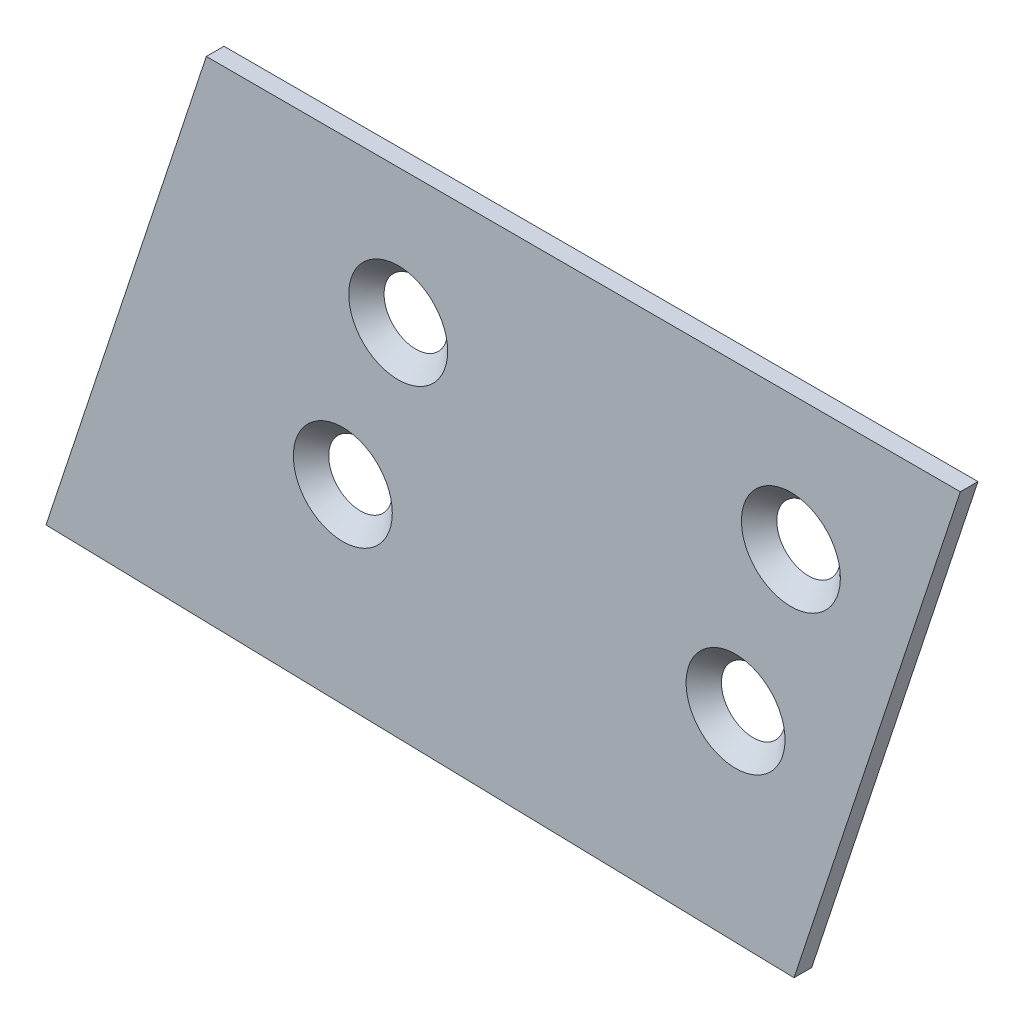
ISO-10303-21;
HEADER;
FILE_DESCRIPTION(('STEP AP214'),'2;1');
FILE_NAME('part.step','',(''),(''),'','','');
FILE_SCHEMA(('AUTOMOTIVE_DESIGN { 1 0 10303 214 1 1 1 1 }'));
ENDSEC;
DATA;
#1=APPLICATION_CONTEXT('core data for automotive mechanical design processes');
#2=APPLICATION_PROTOCOL_DEFINITION('international standard','automotive_design',2000,#1);
#3=PRODUCT_CONTEXT('',#1,'mechanical');
#4=PRODUCT('Part','Part','',(#3));
#5=PRODUCT_RELATED_PRODUCT_CATEGORY('part','',(#4));
#6=PRODUCT_DEFINITION_FORMATION('','',#4);
#7=PRODUCT_DEFINITION_CONTEXT('part definition',#1,'design');
#8=PRODUCT_DEFINITION('design','',#6,#7);
#9=PRODUCT_DEFINITION_SHAPE('','',#8);
#10=(LENGTH_UNIT() NAMED_UNIT(*) SI_UNIT(.MILLI.,.METRE.));
#11=(NAMED_UNIT(*) PLANE_ANGLE_UNIT() SI_UNIT($,.RADIAN.));
#12=(NAMED_UNIT(*) SI_UNIT($,.STERADIAN.) SOLID_ANGLE_UNIT());
#13=UNCERTAINTY_MEASURE_WITH_UNIT(LENGTH_MEASURE(1.E-05),#10,'distance_accuracy_value','');
#14=(GEOMETRIC_REPRESENTATION_CONTEXT(3) GLOBAL_UNCERTAINTY_ASSIGNED_CONTEXT((#13)) GLOBAL_UNIT_ASSIGNED_CONTEXT((#10,
#11,#12)) REPRESENTATION_CONTEXT('',''));
#15=CARTESIAN_POINT('',(0.,0.,0.));
#16=DIRECTION('',(0.,0.,1.));
#17=DIRECTION('',(1.,0.,0.));
#18=AXIS2_PLACEMENT_3D('',#15,#16,#17);
#19=CARTESIAN_POINT('',(0.,0.,0.));
#20=DIRECTION('',(0.,0.,1.));
#21=DIRECTION('',(1.,0.,0.));
#22=AXIS2_PLACEMENT_3D('',#19,#20,#21);
#23=PLANE('',#22);
#24=CARTESIAN_POINT('',(-32.9006659187203,-39.8292302354657,0.));
#25=DIRECTION('',(0.,0.,1.));
#26=DIRECTION('',(1.,0.,0.));
#27=AXIS2_PLACEMENT_3D('',#24,#25,#26);
#28=CIRCLE('',#27,3.6);
#29=CARTESIAN_POINT('',(-29.3006659187203,-39.8292302354657,0.));
#30=VERTEX_POINT('',#29);
#31=EDGE_CURVE('E163',#30,#30,#28,.T.);
#32=ORIENTED_EDGE('',*,*,#31,.T.);
#33=EDGE_LOOP('',(#32));
#34=FACE_BOUND('',#33,.T.);
#35=CARTESIAN_POINT('',(11.5493340812797,-39.8292302354657,0.));
#36=DIRECTION('',(0.,0.,1.));
#37=DIRECTION('',(1.,0.,0.));
#38=AXIS2_PLACEMENT_3D('',#35,#36,#37);
#39=CIRCLE('',#38,3.6);
#40=CARTESIAN_POINT('',(15.1493340812797,-39.8292302354657,0.));
#41=VERTEX_POINT('',#40);
#42=EDGE_CURVE('E167',#41,#41,#39,.T.);
#43=ORIENTED_EDGE('',*,*,#42,.T.);
#44=EDGE_LOOP('',(#43));
#45=FACE_BOUND('',#44,.T.);
#46=CARTESIAN_POINT('',(-39.1672570283145,-58.8221193223097,0.));
#47=DIRECTION('',(0.,0.,1.));
#48=DIRECTION('',(1.,0.,0.));
#49=AXIS2_PLACEMENT_3D('',#46,#47,#48);
#50=CIRCLE('',#49,3.6);
#51=CARTESIAN_POINT('',(-35.5672570283145,-58.8221193223097,0.));
#52=VERTEX_POINT('',#51);
#53=EDGE_CURVE('E102',#52,#52,#50,.T.);
#54=ORIENTED_EDGE('',*,*,#53,.T.);
#55=EDGE_LOOP('',(#54));
#56=FACE_BOUND('',#55,.T.);
#57=DIRECTION('',(-0.31332955547971,-0.949644454342196,0.));
#58=VECTOR('',#57,1.);
#59=CARTESIAN_POINT('',(-54.6191706498154,-24.5892302354657,0.));
#60=LINE('',#59,#58);
#61=CARTESIAN_POINT('',(-54.6191706498154,-24.5892302354657,0.));
#62=VERTEX_POINT('',#61);
#63=CARTESIAN_POINT('',(-72.7647118667564,-79.585039875331,0.));
#64=VERTEX_POINT('',#63);
#65=EDGE_CURVE('E96',#62,#64,#60,.T.);
#66=ORIENTED_EDGE('',*,*,#65,.F.);
#67=DIRECTION('',(-1.,0.,0.));
#68=VECTOR('',#67,1.);
#69=CARTESIAN_POINT('',(-54.6191706498154,-24.5892302354657,0.));
#70=LINE('',#69,#68);
#71=CARTESIAN_POINT('',(30.7248293501846,-24.5892302354657,0.));
#72=VERTEX_POINT('',#71);
#73=EDGE_CURVE('E110',#72,#62,#70,.T.);
#74=ORIENTED_EDGE('',*,*,#73,.F.);
#75=DIRECTION('',(0.31332955547971,0.949644454342196,0.));
#76=VECTOR('',#75,1.);
#77=CARTESIAN_POINT('',(30.7248293501846,-24.5892302354657,0.));
#78=LINE('',#77,#76);
#79=CARTESIAN_POINT('',(11.901447549833,-81.6394504462662,0.));
#80=VERTEX_POINT('',#79);
#81=EDGE_CURVE('E69',#80,#72,#78,.T.);
#82=ORIENTED_EDGE('',*,*,#81,.F.);
#83=DIRECTION('',(0.999705738774359,-0.0242576969560779,0.));
#84=VECTOR('',#83,1.);
#85=CARTESIAN_POINT('',(-72.7647118667564,-79.585039875331,0.));
#86=LINE('',#85,#84);
#87=EDGE_CURVE('E95',#64,#80,#86,.T.);
#88=ORIENTED_EDGE('',*,*,#87,.F.);
#89=EDGE_LOOP('',(#66,#74,#82,#88));
#90=FACE_BOUND('',#89,.T.);
#91=CARTESIAN_POINT('',(5.2827429716855,-58.8221193223097,0.));
#92=DIRECTION('',(0.,0.,1.));
#93=DIRECTION('',(1.,0.,0.));
#94=AXIS2_PLACEMENT_3D('',#91,#92,#93);
#95=CIRCLE('',#94,3.6);
#96=CARTESIAN_POINT('',(8.8827429716855,-58.8221193223097,0.));
#97=VERTEX_POINT('',#96);
#98=EDGE_CURVE('E43',#97,#97,#95,.T.);
#99=ORIENTED_EDGE('',*,*,#98,.T.);
#100=EDGE_LOOP('',(#99));
#101=FACE_BOUND('',#100,.T.);
#102=ADVANCED_FACE('F39',(#34,#45,#56,#90,#101),#23,.F.);
#103=CARTESIAN_POINT('',(-54.6191706498154,-24.5892302354657,2.));
#104=DIRECTION('',(0.949644454342196,-0.31332955547971,0.));
#105=DIRECTION('',(0.31332955547971,0.949644454342196,0.));
#106=AXIS2_PLACEMENT_3D('',#103,#104,#105);
#107=PLANE('',#106);
#108=ORIENTED_EDGE('',*,*,#65,.T.);
#109=DIRECTION('',(0.,0.,1.));
#110=VECTOR('',#109,1.);
#111=CARTESIAN_POINT('',(-72.7647118667564,-79.585039875331,0.));
#112=LINE('',#111,#110);
#113=CARTESIAN_POINT('',(-72.7647118667564,-79.585039875331,2.));
#114=VERTEX_POINT('',#113);
#115=EDGE_CURVE('E97',#64,#114,#112,.T.);
#116=ORIENTED_EDGE('',*,*,#115,.T.);
#117=DIRECTION('',(-0.31332955547971,-0.949644454342196,0.));
#118=VECTOR('',#117,1.);
#119=CARTESIAN_POINT('',(-54.6191706498154,-24.5892302354657,2.));
#120=LINE('',#119,#118);
#121=CARTESIAN_POINT('',(-54.6191706498154,-24.5892302354657,2.));
#122=VERTEX_POINT('',#121);
#123=EDGE_CURVE('E88',#122,#114,#120,.T.);
#124=ORIENTED_EDGE('',*,*,#123,.F.);
#125=DIRECTION('',(0.,0.,-1.));
#126=VECTOR('',#125,1.);
#127=CARTESIAN_POINT('',(-54.6191706498154,-24.5892302354657,2.));
#128=LINE('',#127,#126);
#129=EDGE_CURVE('E49',#122,#62,#128,.T.);
#130=ORIENTED_EDGE('',*,*,#129,.T.);
#131=EDGE_LOOP('',(#108,#116,#124,#130));
#132=FACE_BOUND('',#131,.T.);
#133=ADVANCED_FACE('F41',(#132),#107,.F.);
#134=CARTESIAN_POINT('',(30.7248293501846,-24.5892302354657,2.));
#135=DIRECTION('',(-0.949644454342196,0.31332955547971,0.));
#136=DIRECTION('',(-0.31332955547971,-0.949644454342196,0.));
#137=AXIS2_PLACEMENT_3D('',#134,#135,#136);
#138=PLANE('',#137);
#139=ORIENTED_EDGE('',*,*,#81,.T.);
#140=DIRECTION('',(0.,0.,-1.));
#141=VECTOR('',#140,1.);
#142=CARTESIAN_POINT('',(30.7248293501846,-24.5892302354657,2.));
#143=LINE('',#142,#141);
#144=CARTESIAN_POINT('',(30.7248293501846,-24.5892302354657,2.));
#145=VERTEX_POINT('',#144);
#146=EDGE_CURVE('E11',#145,#72,#143,.T.);
#147=ORIENTED_EDGE('',*,*,#146,.F.);
#148=DIRECTION('',(0.31332955547971,0.949644454342196,0.));
#149=VECTOR('',#148,1.);
#150=CARTESIAN_POINT('',(30.7248293501846,-24.5892302354657,2.));
#151=LINE('',#150,#149);
#152=CARTESIAN_POINT('',(11.901447549833,-81.6394504462662,2.));
#153=VERTEX_POINT('',#152);
#154=EDGE_CURVE('E82',#153,#145,#151,.T.);
#155=ORIENTED_EDGE('',*,*,#154,.F.);
#156=DIRECTION('',(0.,0.,1.));
#157=VECTOR('',#156,1.);
#158=CARTESIAN_POINT('',(11.901447549833,-81.6394504462662,0.));
#159=LINE('',#158,#157);
#160=EDGE_CURVE('E85',#80,#153,#159,.T.);
#161=ORIENTED_EDGE('',*,*,#160,.F.);
#162=EDGE_LOOP('',(#139,#147,#155,#161));
#163=FACE_BOUND('',#162,.T.);
#164=ADVANCED_FACE('F84',(#163),#138,.F.);
#165=CARTESIAN_POINT('',(-54.6191706498154,-24.5892302354657,2.));
#166=DIRECTION('',(0.,-1.,0.));
#167=DIRECTION('',(1.,0.,0.));
#168=AXIS2_PLACEMENT_3D('',#165,#166,#167);
#169=PLANE('',#168);
#170=ORIENTED_EDGE('',*,*,#73,.T.);
#171=ORIENTED_EDGE('',*,*,#129,.F.);
#172=DIRECTION('',(-1.,0.,0.));
#173=VECTOR('',#172,1.);
#174=CARTESIAN_POINT('',(-54.6191706498154,-24.5892302354657,2.));
#175=LINE('',#174,#173);
#176=EDGE_CURVE('E58',#145,#122,#175,.T.);
#177=ORIENTED_EDGE('',*,*,#176,.F.);
#178=ORIENTED_EDGE('',*,*,#146,.T.);
#179=EDGE_LOOP('',(#170,#171,#177,#178));
#180=FACE_BOUND('',#179,.T.);
#181=ADVANCED_FACE('F121',(#180),#169,.F.);
#182=CARTESIAN_POINT('',(0.,0.,2.));
#183=DIRECTION('',(0.,0.,1.));
#184=DIRECTION('',(1.,0.,0.));
#185=AXIS2_PLACEMENT_3D('',#182,#183,#184);
#186=PLANE('',#185);
#187=CARTESIAN_POINT('',(-32.9006659187203,-39.8292302354657,2.));
#188=DIRECTION('',(0.,0.,1.));
#189=DIRECTION('',(1.,0.,0.));
#190=AXIS2_PLACEMENT_3D('',#187,#188,#189);
#191=CIRCLE('',#190,5.6);
#192=CARTESIAN_POINT('',(-27.3006659187203,-39.8292302354657,2.));
#193=VERTEX_POINT('',#192);
#194=EDGE_CURVE('E161',#193,#193,#191,.T.);
#195=ORIENTED_EDGE('',*,*,#194,.F.);
#196=EDGE_LOOP('',(#195));
#197=FACE_BOUND('',#196,.T.);
#198=CARTESIAN_POINT('',(11.5493340812797,-39.8292302354657,2.));
#199=DIRECTION('',(0.,0.,1.));
#200=DIRECTION('',(1.,0.,0.));
#201=AXIS2_PLACEMENT_3D('',#198,#199,#200);
#202=CIRCLE('',#201,5.6);
#203=CARTESIAN_POINT('',(17.1493340812797,-39.8292302354657,2.));
#204=VERTEX_POINT('',#203);
#205=EDGE_CURVE('E164',#204,#204,#202,.T.);
#206=ORIENTED_EDGE('',*,*,#205,.F.);
#207=EDGE_LOOP('',(#206));
#208=FACE_BOUND('',#207,.T.);
#209=CARTESIAN_POINT('',(5.2827429716855,-58.8221193223097,2.));
#210=DIRECTION('',(0.,0.,1.));
#211=DIRECTION('',(1.,0.,0.));
#212=AXIS2_PLACEMENT_3D('',#209,#210,#211);
#213=CIRCLE('',#212,5.6);
#214=CARTESIAN_POINT('',(10.8827429716855,-58.8221193223097,2.));
#215=VERTEX_POINT('',#214);
#216=EDGE_CURVE('E173',#215,#215,#213,.T.);
#217=ORIENTED_EDGE('',*,*,#216,.F.);
#218=EDGE_LOOP('',(#217));
#219=FACE_BOUND('',#218,.T.);
#220=CARTESIAN_POINT('',(-39.1672570283145,-58.8221193223097,2.));
#221=DIRECTION('',(0.,0.,1.));
#222=DIRECTION('',(1.,0.,0.));
#223=AXIS2_PLACEMENT_3D('',#220,#221,#222);
#224=CIRCLE('',#223,5.6);
#225=CARTESIAN_POINT('',(-33.5672570283145,-58.8221193223097,2.));
#226=VERTEX_POINT('',#225);
#227=EDGE_CURVE('E106',#226,#226,#224,.T.);
#228=ORIENTED_EDGE('',*,*,#227,.F.);
#229=EDGE_LOOP('',(#228));
#230=FACE_BOUND('',#229,.T.);
#231=ORIENTED_EDGE('',*,*,#123,.T.);
#232=DIRECTION('',(0.999705738774359,-0.0242576969560779,0.));
#233=VECTOR('',#232,1.);
#234=CARTESIAN_POINT('',(-72.7647118667564,-79.585039875331,2.));
#235=LINE('',#234,#233);
#236=EDGE_CURVE('E94',#114,#153,#235,.T.);
#237=ORIENTED_EDGE('',*,*,#236,.T.);
#238=ORIENTED_EDGE('',*,*,#154,.T.);
#239=ORIENTED_EDGE('',*,*,#176,.T.);
#240=EDGE_LOOP('',(#231,#237,#238,#239));
#241=FACE_BOUND('',#240,.T.);
#242=ADVANCED_FACE('F99',(#197,#208,#219,#230,#241),#186,.T.);
#243=CARTESIAN_POINT('',(-72.7647118667564,-79.585039875331,0.));
#244=DIRECTION('',(-0.0242576969560779,-0.999705738774359,0.));
#245=DIRECTION('',(0.999705738774359,-0.0242576969560779,0.));
#246=AXIS2_PLACEMENT_3D('',#243,#244,#245);
#247=PLANE('',#246);
#248=ORIENTED_EDGE('',*,*,#236,.F.);
#249=ORIENTED_EDGE('',*,*,#115,.F.);
#250=ORIENTED_EDGE('',*,*,#87,.T.);
#251=ORIENTED_EDGE('',*,*,#160,.T.);
#252=EDGE_LOOP('',(#248,#249,#250,#251));
#253=FACE_BOUND('',#252,.T.);
#254=ADVANCED_FACE('F92',(#253),#247,.T.);
#255=CARTESIAN_POINT('',(-39.1672570283145,-58.8221193223097,2.));
#256=DIRECTION('',(0.,0.,1.));
#257=DIRECTION('',(1.,0.,0.));
#258=AXIS2_PLACEMENT_3D('',#255,#256,#257);
#259=CONICAL_SURFACE('',#258,5.6,0.785398163397448);
#260=ORIENTED_EDGE('',*,*,#227,.T.);
#261=EDGE_LOOP('',(#260));
#262=FACE_BOUND('',#261,.T.);
#263=ORIENTED_EDGE('',*,*,#53,.F.);
#264=EDGE_LOOP('',(#263));
#265=FACE_BOUND('',#264,.T.);
#266=ADVANCED_FACE('F141',(#262,#265),#259,.F.);
#267=CARTESIAN_POINT('',(5.2827429716855,-58.8221193223097,2.));
#268=DIRECTION('',(0.,0.,1.));
#269=DIRECTION('',(1.,0.,0.));
#270=AXIS2_PLACEMENT_3D('',#267,#268,#269);
#271=CONICAL_SURFACE('',#270,5.6,0.785398163397449);
#272=ORIENTED_EDGE('',*,*,#216,.T.);
#273=EDGE_LOOP('',(#272));
#274=FACE_BOUND('',#273,.T.);
#275=ORIENTED_EDGE('',*,*,#98,.F.);
#276=EDGE_LOOP('',(#275));
#277=FACE_BOUND('',#276,.T.);
#278=ADVANCED_FACE('F144',(#274,#277),#271,.F.);
#279=CARTESIAN_POINT('',(11.5493340812797,-39.8292302354657,2.));
#280=DIRECTION('',(0.,0.,1.));
#281=DIRECTION('',(1.,0.,0.));
#282=AXIS2_PLACEMENT_3D('',#279,#280,#281);
#283=CONICAL_SURFACE('',#282,5.6,0.785398163397449);
#284=ORIENTED_EDGE('',*,*,#205,.T.);
#285=EDGE_LOOP('',(#284));
#286=FACE_BOUND('',#285,.T.);
#287=ORIENTED_EDGE('',*,*,#42,.F.);
#288=EDGE_LOOP('',(#287));
#289=FACE_BOUND('',#288,.T.);
#290=ADVANCED_FACE('F148',(#286,#289),#283,.F.);
#291=CARTESIAN_POINT('',(-32.9006659187203,-39.8292302354657,2.));
#292=DIRECTION('',(0.,0.,1.));
#293=DIRECTION('',(1.,0.,0.));
#294=AXIS2_PLACEMENT_3D('',#291,#292,#293);
#295=CONICAL_SURFACE('',#294,5.6,0.785398163397449);
#296=ORIENTED_EDGE('',*,*,#194,.T.);
#297=EDGE_LOOP('',(#296));
#298=FACE_BOUND('',#297,.T.);
#299=ORIENTED_EDGE('',*,*,#31,.F.);
#300=EDGE_LOOP('',(#299));
#301=FACE_BOUND('',#300,.T.);
#302=ADVANCED_FACE('F152',(#298,#301),#295,.F.);
#303=CLOSED_SHELL('',(#102,#133,#164,#181,#242,#254,#266,#278,#290,#302));
#304=MANIFOLD_SOLID_BREP('B2',#303);
#305=ADVANCED_BREP_SHAPE_REPRESENTATION('',(#18,#304),#14);
#306=SHAPE_DEFINITION_REPRESENTATION(#9,#305);
ENDSEC;
END-ISO-10303-21;
